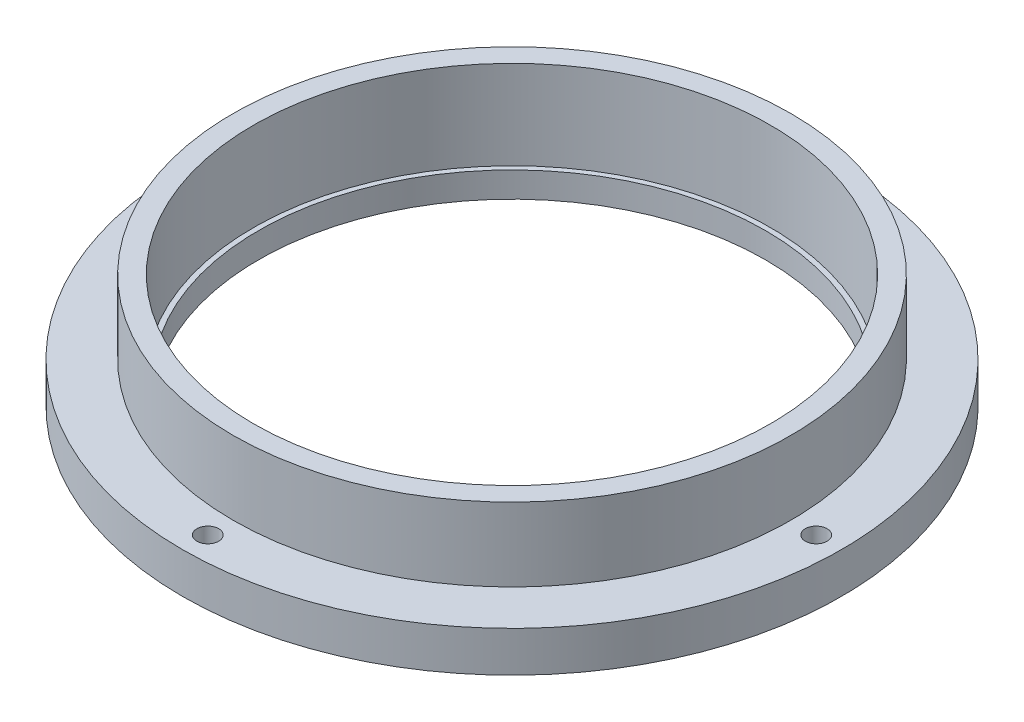
ISO-10303-21;
HEADER;
FILE_DESCRIPTION(('STEP AP214'),'2;1');
FILE_NAME('part.step','',(''),(''),'','','');
FILE_SCHEMA(('AUTOMOTIVE_DESIGN { 1 0 10303 214 1 1 1 1 }'));
ENDSEC;
DATA;
#1=APPLICATION_CONTEXT('core data for automotive mechanical design processes');
#2=APPLICATION_PROTOCOL_DEFINITION('international standard','automotive_design',2000,#1);
#3=PRODUCT_CONTEXT('',#1,'mechanical');
#4=PRODUCT('Part','Part','',(#3));
#5=PRODUCT_RELATED_PRODUCT_CATEGORY('part','',(#4));
#6=PRODUCT_DEFINITION_FORMATION('','',#4);
#7=PRODUCT_DEFINITION_CONTEXT('part definition',#1,'design');
#8=PRODUCT_DEFINITION('design','',#6,#7);
#9=PRODUCT_DEFINITION_SHAPE('','',#8);
#10=(LENGTH_UNIT() NAMED_UNIT(*) SI_UNIT(.MILLI.,.METRE.));
#11=(NAMED_UNIT(*) PLANE_ANGLE_UNIT() SI_UNIT($,.RADIAN.));
#12=(NAMED_UNIT(*) SI_UNIT($,.STERADIAN.) SOLID_ANGLE_UNIT());
#13=UNCERTAINTY_MEASURE_WITH_UNIT(LENGTH_MEASURE(1.E-05),#10,'distance_accuracy_value','');
#14=(GEOMETRIC_REPRESENTATION_CONTEXT(3) GLOBAL_UNCERTAINTY_ASSIGNED_CONTEXT((#13)) GLOBAL_UNIT_ASSIGNED_CONTEXT((#10,
#11,#12)) REPRESENTATION_CONTEXT('',''));
#15=CARTESIAN_POINT('',(0.,0.,0.));
#16=DIRECTION('',(0.,0.,1.));
#17=DIRECTION('',(1.,0.,0.));
#18=AXIS2_PLACEMENT_3D('',#15,#16,#17);
#19=CARTESIAN_POINT('',(-51.,22.5,0.));
#20=DIRECTION('',(0.,1.,0.));
#21=DIRECTION('',(0.,0.,1.));
#22=AXIS2_PLACEMENT_3D('',#19,#20,#21);
#23=PLANE('',#22);
#24=CARTESIAN_POINT('',(0.,22.5,0.));
#25=DIRECTION('',(0.,1.,0.));
#26=DIRECTION('',(0.,0.,1.));
#27=AXIS2_PLACEMENT_3D('',#24,#25,#26);
#28=CIRCLE('',#27,51.);
#29=CARTESIAN_POINT('',(0.,22.5,51.));
#30=VERTEX_POINT('',#29);
#31=EDGE_CURVE('E17',#30,#30,#28,.F.);
#32=ORIENTED_EDGE('',*,*,#31,.T.);
#33=EDGE_LOOP('',(#32));
#34=FACE_BOUND('',#33,.T.);
#35=CARTESIAN_POINT('',(0.,22.5,0.));
#36=DIRECTION('',(0.,1.,0.));
#37=DIRECTION('',(0.,0.,1.));
#38=AXIS2_PLACEMENT_3D('',#35,#36,#37);
#39=CIRCLE('',#38,55.);
#40=CARTESIAN_POINT('',(0.,22.5,55.));
#41=VERTEX_POINT('',#40);
#42=EDGE_CURVE('E63',#41,#41,#39,.F.);
#43=ORIENTED_EDGE('',*,*,#42,.F.);
#44=EDGE_LOOP('',(#43));
#45=FACE_BOUND('',#44,.T.);
#46=ADVANCED_FACE('F14',(#34,#45),#23,.T.);
#47=CARTESIAN_POINT('',(0.,110.594226593079,0.));
#48=DIRECTION('',(0.,1.,0.));
#49=DIRECTION('',(0.,0.,1.));
#50=AXIS2_PLACEMENT_3D('',#47,#48,#49);
#51=CYLINDRICAL_SURFACE('',#50,51.);
#52=ORIENTED_EDGE('',*,*,#31,.F.);
#53=EDGE_LOOP('',(#52));
#54=FACE_BOUND('',#53,.T.);
#55=CARTESIAN_POINT('',(0.,5.,0.));
#56=DIRECTION('',(0.,1.,0.));
#57=DIRECTION('',(0.,0.,1.));
#58=AXIS2_PLACEMENT_3D('',#55,#56,#57);
#59=CIRCLE('',#58,51.);
#60=CARTESIAN_POINT('',(0.,5.,51.));
#61=VERTEX_POINT('',#60);
#62=EDGE_CURVE('E61',#61,#61,#59,.T.);
#63=ORIENTED_EDGE('',*,*,#62,.F.);
#64=EDGE_LOOP('',(#63));
#65=FACE_BOUND('',#64,.T.);
#66=ADVANCED_FACE('F72',(#54,#65),#51,.F.);
#67=CARTESIAN_POINT('',(0.,110.594226593079,0.));
#68=DIRECTION('',(0.,1.,0.));
#69=DIRECTION('',(0.,0.,1.));
#70=AXIS2_PLACEMENT_3D('',#67,#68,#69);
#71=CYLINDRICAL_SURFACE('',#70,55.);
#72=CARTESIAN_POINT('',(0.,8.00000000000001,0.));
#73=DIRECTION('',(0.,1.,0.));
#74=DIRECTION('',(0.,0.,1.));
#75=AXIS2_PLACEMENT_3D('',#72,#73,#74);
#76=CIRCLE('',#75,55.);
#77=CARTESIAN_POINT('',(0.,8.00000000000001,55.));
#78=VERTEX_POINT('',#77);
#79=EDGE_CURVE('E58',#78,#78,#76,.F.);
#80=ORIENTED_EDGE('',*,*,#79,.F.);
#81=EDGE_LOOP('',(#80));
#82=FACE_BOUND('',#81,.T.);
#83=ORIENTED_EDGE('',*,*,#42,.T.);
#84=EDGE_LOOP('',(#83));
#85=FACE_BOUND('',#84,.T.);
#86=ADVANCED_FACE('F75',(#82,#85),#71,.T.);
#87=CARTESIAN_POINT('',(-50.,5.,0.));
#88=DIRECTION('',(0.,1.,0.));
#89=DIRECTION('',(0.,0.,1.));
#90=AXIS2_PLACEMENT_3D('',#87,#88,#89);
#91=PLANE('',#90);
#92=CARTESIAN_POINT('',(0.,5.,0.));
#93=DIRECTION('',(0.,1.,0.));
#94=DIRECTION('',(0.,0.,1.));
#95=AXIS2_PLACEMENT_3D('',#92,#93,#94);
#96=CIRCLE('',#95,50.);
#97=CARTESIAN_POINT('',(0.,5.,50.));
#98=VERTEX_POINT('',#97);
#99=EDGE_CURVE('E43',#98,#98,#96,.F.);
#100=ORIENTED_EDGE('',*,*,#99,.T.);
#101=EDGE_LOOP('',(#100));
#102=FACE_BOUND('',#101,.T.);
#103=ORIENTED_EDGE('',*,*,#62,.T.);
#104=EDGE_LOOP('',(#103));
#105=FACE_BOUND('',#104,.T.);
#106=ADVANCED_FACE('F78',(#102,#105),#91,.T.);
#107=CARTESIAN_POINT('',(-55.,8.,0.));
#108=DIRECTION('',(0.,1.,0.));
#109=DIRECTION('',(0.,0.,1.));
#110=AXIS2_PLACEMENT_3D('',#107,#108,#109);
#111=PLANE('',#110);
#112=ORIENTED_EDGE('',*,*,#79,.T.);
#113=EDGE_LOOP('',(#112));
#114=FACE_BOUND('',#113,.T.);
#115=CARTESIAN_POINT('',(0.,7.99999999999999,0.));
#116=DIRECTION('',(0.,1.,0.));
#117=DIRECTION('',(0.,0.,1.));
#118=AXIS2_PLACEMENT_3D('',#115,#116,#117);
#119=CIRCLE('',#118,65.);
#120=CARTESIAN_POINT('',(0.,7.99999999999999,65.));
#121=VERTEX_POINT('',#120);
#122=EDGE_CURVE('E40',#121,#121,#119,.F.);
#123=ORIENTED_EDGE('',*,*,#122,.F.);
#124=EDGE_LOOP('',(#123));
#125=FACE_BOUND('',#124,.T.);
#126=CARTESIAN_POINT('',(0.,8.,-60.));
#127=DIRECTION('',(0.,1.,0.));
#128=DIRECTION('',(0.,0.,1.));
#129=AXIS2_PLACEMENT_3D('',#126,#127,#128);
#130=CIRCLE('',#129,2.14999999999999);
#131=CARTESIAN_POINT('',(0.,8.,-57.85));
#132=VERTEX_POINT('',#131);
#133=EDGE_CURVE('E46',#132,#132,#130,.F.);
#134=ORIENTED_EDGE('',*,*,#133,.T.);
#135=EDGE_LOOP('',(#134));
#136=FACE_BOUND('',#135,.T.);
#137=CARTESIAN_POINT('',(-60.,8.,2.09488880330588E-13));
#138=DIRECTION('',(0.,1.,0.));
#139=DIRECTION('',(0.,0.,1.));
#140=AXIS2_PLACEMENT_3D('',#137,#138,#139);
#141=CIRCLE('',#140,2.14999999999999);
#142=CARTESIAN_POINT('',(-60.,8.,2.1500000000002));
#143=VERTEX_POINT('',#142);
#144=EDGE_CURVE('E49',#143,#143,#141,.F.);
#145=ORIENTED_EDGE('',*,*,#144,.T.);
#146=EDGE_LOOP('',(#145));
#147=FACE_BOUND('',#146,.T.);
#148=CARTESIAN_POINT('',(0.,8.,60.));
#149=DIRECTION('',(0.,1.,0.));
#150=DIRECTION('',(0.,0.,1.));
#151=AXIS2_PLACEMENT_3D('',#148,#149,#150);
#152=CIRCLE('',#151,2.14999999999999);
#153=CARTESIAN_POINT('',(0.,8.,62.15));
#154=VERTEX_POINT('',#153);
#155=EDGE_CURVE('E52',#154,#154,#152,.F.);
#156=ORIENTED_EDGE('',*,*,#155,.T.);
#157=EDGE_LOOP('',(#156));
#158=FACE_BOUND('',#157,.T.);
#159=CARTESIAN_POINT('',(60.,8.,-6.28466640991764E-13));
#160=DIRECTION('',(0.,1.,0.));
#161=DIRECTION('',(0.,0.,1.));
#162=AXIS2_PLACEMENT_3D('',#159,#160,#161);
#163=CIRCLE('',#162,2.14999999999999);
#164=CARTESIAN_POINT('',(60.,8.,2.14999999999936));
#165=VERTEX_POINT('',#164);
#166=EDGE_CURVE('E55',#165,#165,#163,.F.);
#167=ORIENTED_EDGE('',*,*,#166,.T.);
#168=EDGE_LOOP('',(#167));
#169=FACE_BOUND('',#168,.T.);
#170=ADVANCED_FACE('F80',(#114,#125,#136,#147,#158,#169),#111,.T.);
#171=CARTESIAN_POINT('',(60.,8.,-6.28466640991764E-13));
#172=DIRECTION('',(0.,1.,0.));
#173=DIRECTION('',(0.,0.,1.));
#174=AXIS2_PLACEMENT_3D('',#171,#172,#173);
#175=CYLINDRICAL_SURFACE('',#174,2.14999999999999);
#176=ORIENTED_EDGE('',*,*,#166,.F.);
#177=EDGE_LOOP('',(#176));
#178=FACE_BOUND('',#177,.T.);
#179=CARTESIAN_POINT('',(60.,0.,-6.28466640991764E-13));
#180=DIRECTION('',(0.,1.,0.));
#181=DIRECTION('',(0.,0.,1.));
#182=AXIS2_PLACEMENT_3D('',#179,#180,#181);
#183=CIRCLE('',#182,2.14999999999999);
#184=CARTESIAN_POINT('',(60.,0.,2.14999999999936));
#185=VERTEX_POINT('',#184);
#186=EDGE_CURVE('E37',#185,#185,#183,.T.);
#187=ORIENTED_EDGE('',*,*,#186,.F.);
#188=EDGE_LOOP('',(#187));
#189=FACE_BOUND('',#188,.T.);
#190=ADVANCED_FACE('F88',(#178,#189),#175,.F.);
#191=CARTESIAN_POINT('',(0.,8.,60.));
#192=DIRECTION('',(0.,1.,0.));
#193=DIRECTION('',(0.,0.,1.));
#194=AXIS2_PLACEMENT_3D('',#191,#192,#193);
#195=CYLINDRICAL_SURFACE('',#194,2.14999999999999);
#196=ORIENTED_EDGE('',*,*,#155,.F.);
#197=EDGE_LOOP('',(#196));
#198=FACE_BOUND('',#197,.T.);
#199=CARTESIAN_POINT('',(0.,0.,60.));
#200=DIRECTION('',(0.,1.,0.));
#201=DIRECTION('',(0.,0.,1.));
#202=AXIS2_PLACEMENT_3D('',#199,#200,#201);
#203=CIRCLE('',#202,2.14999999999999);
#204=CARTESIAN_POINT('',(0.,0.,62.15));
#205=VERTEX_POINT('',#204);
#206=EDGE_CURVE('E34',#205,#205,#203,.T.);
#207=ORIENTED_EDGE('',*,*,#206,.F.);
#208=EDGE_LOOP('',(#207));
#209=FACE_BOUND('',#208,.T.);
#210=ADVANCED_FACE('F115',(#198,#209),#195,.F.);
#211=CARTESIAN_POINT('',(-60.,8.,2.09488880330588E-13));
#212=DIRECTION('',(0.,1.,0.));
#213=DIRECTION('',(0.,0.,1.));
#214=AXIS2_PLACEMENT_3D('',#211,#212,#213);
#215=CYLINDRICAL_SURFACE('',#214,2.14999999999999);
#216=ORIENTED_EDGE('',*,*,#144,.F.);
#217=EDGE_LOOP('',(#216));
#218=FACE_BOUND('',#217,.T.);
#219=CARTESIAN_POINT('',(-60.,0.,2.09488880330588E-13));
#220=DIRECTION('',(0.,1.,0.));
#221=DIRECTION('',(0.,0.,1.));
#222=AXIS2_PLACEMENT_3D('',#219,#220,#221);
#223=CIRCLE('',#222,2.14999999999999);
#224=CARTESIAN_POINT('',(-60.,0.,2.1500000000002));
#225=VERTEX_POINT('',#224);
#226=EDGE_CURVE('E31',#225,#225,#223,.T.);
#227=ORIENTED_EDGE('',*,*,#226,.F.);
#228=EDGE_LOOP('',(#227));
#229=FACE_BOUND('',#228,.T.);
#230=ADVANCED_FACE('F111',(#218,#229),#215,.F.);
#231=CARTESIAN_POINT('',(0.,8.,-60.));
#232=DIRECTION('',(0.,1.,0.));
#233=DIRECTION('',(0.,0.,1.));
#234=AXIS2_PLACEMENT_3D('',#231,#232,#233);
#235=CYLINDRICAL_SURFACE('',#234,2.14999999999999);
#236=ORIENTED_EDGE('',*,*,#133,.F.);
#237=EDGE_LOOP('',(#236));
#238=FACE_BOUND('',#237,.T.);
#239=CARTESIAN_POINT('',(0.,0.,-60.));
#240=DIRECTION('',(0.,1.,0.));
#241=DIRECTION('',(0.,0.,1.));
#242=AXIS2_PLACEMENT_3D('',#239,#240,#241);
#243=CIRCLE('',#242,2.14999999999999);
#244=CARTESIAN_POINT('',(0.,0.,-57.85));
#245=VERTEX_POINT('',#244);
#246=EDGE_CURVE('E26',#245,#245,#243,.T.);
#247=ORIENTED_EDGE('',*,*,#246,.F.);
#248=EDGE_LOOP('',(#247));
#249=FACE_BOUND('',#248,.T.);
#250=ADVANCED_FACE('F107',(#238,#249),#235,.F.);
#251=CARTESIAN_POINT('',(0.,110.594226593079,0.));
#252=DIRECTION('',(0.,1.,0.));
#253=DIRECTION('',(0.,0.,1.));
#254=AXIS2_PLACEMENT_3D('',#251,#252,#253);
#255=CYLINDRICAL_SURFACE('',#254,50.);
#256=ORIENTED_EDGE('',*,*,#99,.F.);
#257=EDGE_LOOP('',(#256));
#258=FACE_BOUND('',#257,.T.);
#259=CARTESIAN_POINT('',(0.,0.,0.));
#260=DIRECTION('',(0.,1.,0.));
#261=DIRECTION('',(0.,0.,1.));
#262=AXIS2_PLACEMENT_3D('',#259,#260,#261);
#263=CIRCLE('',#262,50.);
#264=CARTESIAN_POINT('',(0.,0.,50.));
#265=VERTEX_POINT('',#264);
#266=EDGE_CURVE('E21',#265,#265,#263,.T.);
#267=ORIENTED_EDGE('',*,*,#266,.F.);
#268=EDGE_LOOP('',(#267));
#269=FACE_BOUND('',#268,.T.);
#270=ADVANCED_FACE('F100',(#258,#269),#255,.F.);
#271=CARTESIAN_POINT('',(0.,110.594226593079,0.));
#272=DIRECTION('',(0.,1.,0.));
#273=DIRECTION('',(0.,0.,1.));
#274=AXIS2_PLACEMENT_3D('',#271,#272,#273);
#275=CYLINDRICAL_SURFACE('',#274,65.);
#276=CARTESIAN_POINT('',(0.,0.,0.));
#277=DIRECTION('',(0.,1.,0.));
#278=DIRECTION('',(0.,0.,1.));
#279=AXIS2_PLACEMENT_3D('',#276,#277,#278);
#280=CIRCLE('',#279,65.);
#281=CARTESIAN_POINT('',(0.,0.,65.));
#282=VERTEX_POINT('',#281);
#283=EDGE_CURVE('E10',#282,#282,#280,.F.);
#284=ORIENTED_EDGE('',*,*,#283,.F.);
#285=EDGE_LOOP('',(#284));
#286=FACE_BOUND('',#285,.T.);
#287=ORIENTED_EDGE('',*,*,#122,.T.);
#288=EDGE_LOOP('',(#287));
#289=FACE_BOUND('',#288,.T.);
#290=ADVANCED_FACE('F95',(#286,#289),#275,.T.);
#291=CARTESIAN_POINT('',(-65.,0.,0.));
#292=DIRECTION('',(0.,-1.,0.));
#293=DIRECTION('',(0.,0.,-1.));
#294=AXIS2_PLACEMENT_3D('',#291,#292,#293);
#295=PLANE('',#294);
#296=ORIENTED_EDGE('',*,*,#283,.T.);
#297=EDGE_LOOP('',(#296));
#298=FACE_BOUND('',#297,.T.);
#299=ORIENTED_EDGE('',*,*,#266,.T.);
#300=EDGE_LOOP('',(#299));
#301=FACE_BOUND('',#300,.T.);
#302=ORIENTED_EDGE('',*,*,#246,.T.);
#303=EDGE_LOOP('',(#302));
#304=FACE_BOUND('',#303,.T.);
#305=ORIENTED_EDGE('',*,*,#226,.T.);
#306=EDGE_LOOP('',(#305));
#307=FACE_BOUND('',#306,.T.);
#308=ORIENTED_EDGE('',*,*,#206,.T.);
#309=EDGE_LOOP('',(#308));
#310=FACE_BOUND('',#309,.T.);
#311=ORIENTED_EDGE('',*,*,#186,.T.);
#312=EDGE_LOOP('',(#311));
#313=FACE_BOUND('',#312,.T.);
#314=ADVANCED_FACE('F93',(#298,#301,#304,#307,#310,#313),#295,.T.);
#315=CLOSED_SHELL('',(#46,#66,#86,#106,#170,#190,#210,#230,#250,#270,#290,#314));
#316=MANIFOLD_SOLID_BREP('B1',#315);
#317=ADVANCED_BREP_SHAPE_REPRESENTATION('',(#18,#316),#14);
#318=SHAPE_DEFINITION_REPRESENTATION(#9,#317);
ENDSEC;
END-ISO-10303-21;
